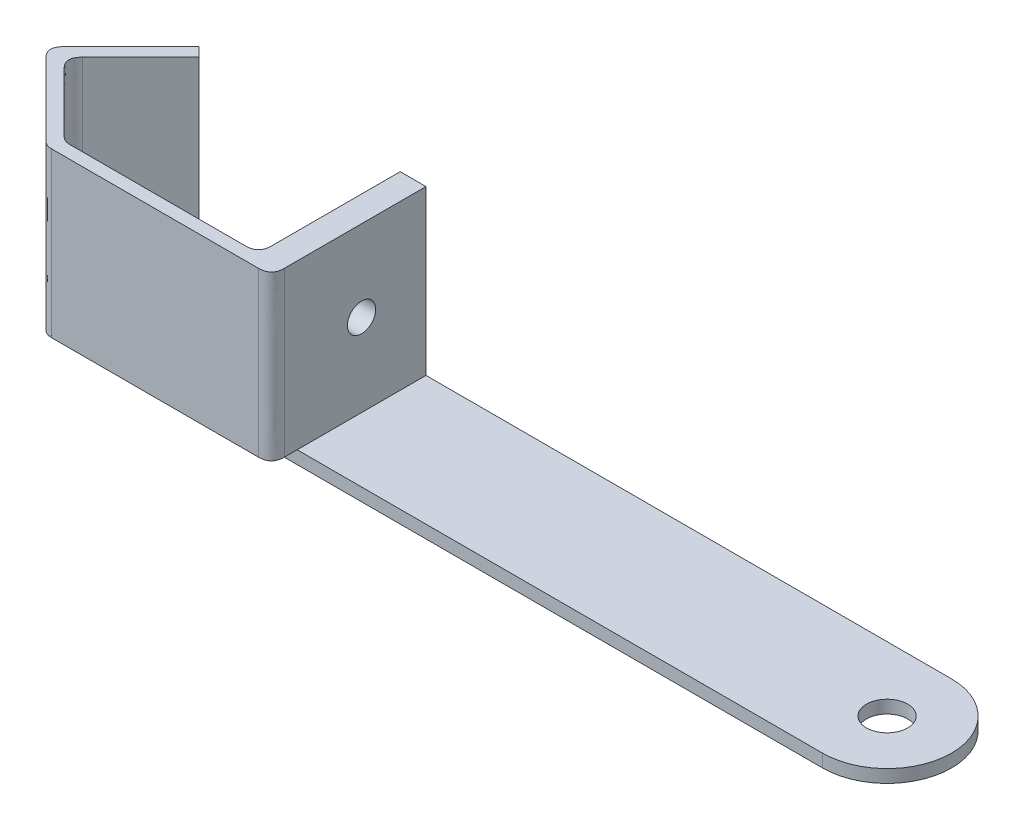
ISO-10303-21;
HEADER;
FILE_DESCRIPTION(('STEP AP214'),'2;1');
FILE_NAME('part.step','',(''),(''),'','','');
FILE_SCHEMA(('AUTOMOTIVE_DESIGN { 1 0 10303 214 1 1 1 1 }'));
ENDSEC;
DATA;
#1=APPLICATION_CONTEXT('core data for automotive mechanical design processes');
#2=APPLICATION_PROTOCOL_DEFINITION('international standard','automotive_design',2000,#1);
#3=PRODUCT_CONTEXT('',#1,'mechanical');
#4=PRODUCT('Part','Part','',(#3));
#5=PRODUCT_RELATED_PRODUCT_CATEGORY('part','',(#4));
#6=PRODUCT_DEFINITION_FORMATION('','',#4);
#7=PRODUCT_DEFINITION_CONTEXT('part definition',#1,'design');
#8=PRODUCT_DEFINITION('design','',#6,#7);
#9=PRODUCT_DEFINITION_SHAPE('','',#8);
#10=(LENGTH_UNIT() NAMED_UNIT(*) SI_UNIT(.MILLI.,.METRE.));
#11=(NAMED_UNIT(*) PLANE_ANGLE_UNIT() SI_UNIT($,.RADIAN.));
#12=(NAMED_UNIT(*) SI_UNIT($,.STERADIAN.) SOLID_ANGLE_UNIT());
#13=UNCERTAINTY_MEASURE_WITH_UNIT(LENGTH_MEASURE(1.E-05),#10,'distance_accuracy_value','');
#14=(GEOMETRIC_REPRESENTATION_CONTEXT(3) GLOBAL_UNCERTAINTY_ASSIGNED_CONTEXT((#13)) GLOBAL_UNIT_ASSIGNED_CONTEXT((#10,
#11,#12)) REPRESENTATION_CONTEXT('',''));
#15=CARTESIAN_POINT('',(0.,0.,0.));
#16=DIRECTION('',(0.,0.,1.));
#17=DIRECTION('',(1.,0.,0.));
#18=AXIS2_PLACEMENT_3D('',#15,#16,#17);
#19=CARTESIAN_POINT('',(-108.712,-2.54,0.));
#20=DIRECTION('',(-1.,0.,0.));
#21=DIRECTION('',(0.,0.,1.));
#22=AXIS2_PLACEMENT_3D('',#19,#20,#21);
#23=PLANE('',#22);
#24=CARTESIAN_POINT('',(-108.712,16.256,12.7));
#25=DIRECTION('',(1.,0.,0.));
#26=DIRECTION('',(0.,0.,-1.));
#27=AXIS2_PLACEMENT_3D('',#24,#25,#26);
#28=CIRCLE('',#27,2.794);
#29=CARTESIAN_POINT('',(-108.712,16.256,9.906));
#30=VERTEX_POINT('',#29);
#31=EDGE_CURVE('E281',#30,#30,#28,.T.);
#32=ORIENTED_EDGE('',*,*,#31,.T.);
#33=EDGE_LOOP('',(#32));
#34=FACE_BOUND('',#33,.T.);
#35=DIRECTION('',(0.,1.,0.));
#36=VECTOR('',#35,1.);
#37=CARTESIAN_POINT('',(-108.712,-2.54,25.4));
#38=LINE('',#37,#36);
#39=CARTESIAN_POINT('',(-108.712,-2.54,25.4));
#40=VERTEX_POINT('',#39);
#41=CARTESIAN_POINT('',(-108.712,0.,25.4));
#42=VERTEX_POINT('',#41);
#43=EDGE_CURVE('E511',#40,#42,#38,.T.);
#44=ORIENTED_EDGE('',*,*,#43,.T.);
#45=CARTESIAN_POINT('',(-108.712,33.8709,25.4));
#46=CARTESIAN_POINT('',(-108.712,22.0429666666667,25.4));
#47=CARTESIAN_POINT('',(-108.712,10.2150333333333,25.4));
#48=CARTESIAN_POINT('',(-108.712,-1.6129,25.4));
#49=(BOUNDED_CURVE() B_SPLINE_CURVE(3,(#45,#46,#47,#48),.UNSPECIFIED.,.F.,
.F.) B_SPLINE_CURVE_WITH_KNOTS((4,4),(0.000927099999999993,0.0364109),
.UNSPECIFIED.) CURVE() GEOMETRIC_REPRESENTATION_ITEM() RATIONAL_B_SPLINE_CURVE((1.,1.,1.,1.)) REPRESENTATION_ITEM(''));
#50=CARTESIAN_POINT('',(-108.712,32.258,25.4));
#51=VERTEX_POINT('',#50);
#52=EDGE_CURVE('E489',#42,#51,#49,.F.);
#53=ORIENTED_EDGE('',*,*,#52,.T.);
#54=DIRECTION('',(0.,0.,1.));
#55=VECTOR('',#54,1.);
#56=CARTESIAN_POINT('',(-108.712,32.258,0.));
#57=LINE('',#56,#55);
#58=CARTESIAN_POINT('',(-108.712,32.258,0.));
#59=VERTEX_POINT('',#58);
#60=EDGE_CURVE('E719',#59,#51,#57,.T.);
#61=ORIENTED_EDGE('',*,*,#60,.F.);
#62=DIRECTION('',(0.,1.,0.));
#63=VECTOR('',#62,1.);
#64=CARTESIAN_POINT('',(-108.712,-2.54,0.));
#65=LINE('',#64,#63);
#66=CARTESIAN_POINT('',(-108.712,-2.54,0.));
#67=VERTEX_POINT('',#66);
#68=EDGE_CURVE('E697',#67,#59,#65,.T.);
#69=ORIENTED_EDGE('',*,*,#68,.F.);
#70=DIRECTION('',(0.,0.,1.));
#71=VECTOR('',#70,1.);
#72=CARTESIAN_POINT('',(-108.712,-2.54,0.));
#73=LINE('',#72,#71);
#74=EDGE_CURVE('E1226',#67,#40,#73,.T.);
#75=ORIENTED_EDGE('',*,*,#74,.T.);
#76=EDGE_LOOP('',(#44,#53,#61,#69,#75));
#77=FACE_BOUND('',#76,.T.);
#78=ADVANCED_FACE('F54',(#34,#77),#23,.T.);
#79=CARTESIAN_POINT('',(0.,-2.54,12.7));
#80=DIRECTION('',(0.,1.,0.));
#81=DIRECTION('',(0.,0.,1.));
#82=AXIS2_PLACEMENT_3D('',#79,#80,#81);
#83=CYLINDRICAL_SURFACE('',#82,12.7);
#84=CARTESIAN_POINT('',(0.,0.,12.7));
#85=DIRECTION('',(0.,1.,0.));
#86=DIRECTION('',(0.,0.,1.));
#87=AXIS2_PLACEMENT_3D('',#84,#85,#86);
#88=CIRCLE('',#87,12.7);
#89=CARTESIAN_POINT('',(0.,0.,25.4));
#90=VERTEX_POINT('',#89);
#91=CARTESIAN_POINT('',(0.,0.,0.));
#92=VERTEX_POINT('',#91);
#93=EDGE_CURVE('E1213',#90,#92,#88,.T.);
#94=ORIENTED_EDGE('',*,*,#93,.F.);
#95=DIRECTION('',(0.,1.,0.));
#96=VECTOR('',#95,1.);
#97=CARTESIAN_POINT('',(0.,-2.54,25.4));
#98=LINE('',#97,#96);
#99=CARTESIAN_POINT('',(0.,-2.54,25.4));
#100=VERTEX_POINT('',#99);
#101=EDGE_CURVE('E503',#100,#90,#98,.T.);
#102=ORIENTED_EDGE('',*,*,#101,.F.);
#103=CARTESIAN_POINT('',(0.,-2.54,12.7));
#104=DIRECTION('',(0.,1.,0.));
#105=DIRECTION('',(0.,0.,1.));
#106=AXIS2_PLACEMENT_3D('',#103,#104,#105);
#107=CIRCLE('',#106,12.7);
#108=CARTESIAN_POINT('',(0.,-2.54,0.));
#109=VERTEX_POINT('',#108);
#110=EDGE_CURVE('E704',#100,#109,#107,.T.);
#111=ORIENTED_EDGE('',*,*,#110,.T.);
#112=DIRECTION('',(0.,1.,0.));
#113=VECTOR('',#112,1.);
#114=CARTESIAN_POINT('',(0.,-2.54,0.));
#115=LINE('',#114,#113);
#116=EDGE_CURVE('E716',#109,#92,#115,.T.);
#117=ORIENTED_EDGE('',*,*,#116,.T.);
#118=EDGE_LOOP('',(#94,#102,#111,#117));
#119=FACE_BOUND('',#118,.T.);
#120=ADVANCED_FACE('F670',(#119),#83,.T.);
#121=CARTESIAN_POINT('',(0.,-2.54,25.4));
#122=DIRECTION('',(0.,0.,1.));
#123=DIRECTION('',(1.,0.,0.));
#124=AXIS2_PLACEMENT_3D('',#121,#122,#123);
#125=PLANE('',#124);
#126=DIRECTION('',(1.,0.,0.));
#127=VECTOR('',#126,1.);
#128=CARTESIAN_POINT('',(0.,0.,25.4));
#129=LINE('',#128,#127);
#130=CARTESIAN_POINT('',(-103.632,0.,25.4));
#131=VERTEX_POINT('',#130);
#132=EDGE_CURVE('E700',#42,#131,#129,.T.);
#133=ORIENTED_EDGE('',*,*,#132,.F.);
#134=ORIENTED_EDGE('',*,*,#43,.F.);
#135=DIRECTION('',(1.,0.,0.));
#136=VECTOR('',#135,1.);
#137=CARTESIAN_POINT('',(0.,-2.54,25.4));
#138=LINE('',#137,#136);
#139=EDGE_CURVE('E718',#40,#100,#138,.T.);
#140=ORIENTED_EDGE('',*,*,#139,.T.);
#141=ORIENTED_EDGE('',*,*,#101,.T.);
#142=EDGE_CURVE('E705',#131,#90,#129,.T.);
#143=ORIENTED_EDGE('',*,*,#142,.F.);
#144=EDGE_LOOP('',(#133,#134,#140,#141,#143));
#145=FACE_BOUND('',#144,.T.);
#146=ADVANCED_FACE('F676',(#145),#125,.T.);
#147=CARTESIAN_POINT('',(0.,-2.54,0.));
#148=DIRECTION('',(0.,0.,-1.));
#149=DIRECTION('',(-1.,0.,0.));
#150=AXIS2_PLACEMENT_3D('',#147,#148,#149);
#151=PLANE('',#150);
#152=DIRECTION('',(-1.,0.,0.));
#153=VECTOR('',#152,1.);
#154=CARTESIAN_POINT('',(0.,0.,0.));
#155=LINE('',#154,#153);
#156=CARTESIAN_POINT('',(-103.632,0.,0.));
#157=VERTEX_POINT('',#156);
#158=EDGE_CURVE('E711',#92,#157,#155,.T.);
#159=ORIENTED_EDGE('',*,*,#158,.F.);
#160=ORIENTED_EDGE('',*,*,#116,.F.);
#161=DIRECTION('',(-1.,0.,0.));
#162=VECTOR('',#161,1.);
#163=CARTESIAN_POINT('',(0.,-2.54,0.));
#164=LINE('',#163,#162);
#165=EDGE_CURVE('E1229',#109,#67,#164,.T.);
#166=ORIENTED_EDGE('',*,*,#165,.T.);
#167=ORIENTED_EDGE('',*,*,#68,.T.);
#168=DIRECTION('',(-1.,0.,0.));
#169=VECTOR('',#168,1.);
#170=CARTESIAN_POINT('',(-103.632,32.258,0.));
#171=LINE('',#170,#169);
#172=CARTESIAN_POINT('',(-103.632,32.258,0.));
#173=VERTEX_POINT('',#172);
#174=EDGE_CURVE('E1238',#173,#59,#171,.T.);
#175=ORIENTED_EDGE('',*,*,#174,.F.);
#176=DIRECTION('',(0.,1.,0.));
#177=VECTOR('',#176,1.);
#178=CARTESIAN_POINT('',(-103.632,0.,0.));
#179=LINE('',#178,#177);
#180=EDGE_CURVE('E721',#157,#173,#179,.T.);
#181=ORIENTED_EDGE('',*,*,#180,.F.);
#182=EDGE_LOOP('',(#159,#160,#166,#167,#175,#181));
#183=FACE_BOUND('',#182,.T.);
#184=ADVANCED_FACE('F684',(#183),#151,.T.);
#185=CARTESIAN_POINT('',(0.,-2.54,12.7));
#186=DIRECTION('',(0.,1.,0.));
#187=DIRECTION('',(0.,0.,1.));
#188=AXIS2_PLACEMENT_3D('',#185,#186,#187);
#189=PLANE('',#188);
#190=CARTESIAN_POINT('',(0.,-2.54,12.7));
#191=DIRECTION('',(0.,1.,0.));
#192=DIRECTION('',(0.,0.,1.));
#193=AXIS2_PLACEMENT_3D('',#190,#191,#192);
#194=CIRCLE('',#193,4.064);
#195=CARTESIAN_POINT('',(0.,-2.54,16.764));
#196=VERTEX_POINT('',#195);
#197=EDGE_CURVE('E1217',#196,#196,#194,.T.);
#198=ORIENTED_EDGE('',*,*,#197,.T.);
#199=EDGE_LOOP('',(#198));
#200=FACE_BOUND('',#199,.T.);
#201=ORIENTED_EDGE('',*,*,#110,.F.);
#202=ORIENTED_EDGE('',*,*,#139,.F.);
#203=ORIENTED_EDGE('',*,*,#74,.F.);
#204=ORIENTED_EDGE('',*,*,#165,.F.);
#205=EDGE_LOOP('',(#201,#202,#203,#204));
#206=FACE_BOUND('',#205,.T.);
#207=ADVANCED_FACE('F966',(#200,#206),#189,.F.);
#208=CARTESIAN_POINT('',(0.,0.,12.7));
#209=DIRECTION('',(0.,1.,0.));
#210=DIRECTION('',(0.,0.,1.));
#211=AXIS2_PLACEMENT_3D('',#208,#209,#210);
#212=PLANE('',#211);
#213=DIRECTION('',(0.,0.,-1.));
#214=VECTOR('',#213,1.);
#215=CARTESIAN_POINT('',(-103.632,0.,0.));
#216=LINE('',#215,#214);
#217=EDGE_CURVE('E495',#131,#157,#216,.T.);
#218=ORIENTED_EDGE('',*,*,#217,.F.);
#219=ORIENTED_EDGE('',*,*,#142,.T.);
#220=ORIENTED_EDGE('',*,*,#93,.T.);
#221=ORIENTED_EDGE('',*,*,#158,.T.);
#222=EDGE_LOOP('',(#218,#219,#220,#221));
#223=FACE_BOUND('',#222,.T.);
#224=CARTESIAN_POINT('',(0.,0.,12.7));
#225=DIRECTION('',(0.,1.,0.));
#226=DIRECTION('',(0.,0.,1.));
#227=AXIS2_PLACEMENT_3D('',#224,#225,#226);
#228=CIRCLE('',#227,4.064);
#229=CARTESIAN_POINT('',(0.,0.,16.764));
#230=VERTEX_POINT('',#229);
#231=EDGE_CURVE('E1221',#230,#230,#228,.T.);
#232=ORIENTED_EDGE('',*,*,#231,.F.);
#233=EDGE_LOOP('',(#232));
#234=FACE_BOUND('',#233,.T.);
#235=ADVANCED_FACE('F959',(#223,#234),#212,.T.);
#236=CARTESIAN_POINT('',(0.,-2.54,12.7));
#237=DIRECTION('',(0.,1.,0.));
#238=DIRECTION('',(0.,0.,1.));
#239=AXIS2_PLACEMENT_3D('',#236,#237,#238);
#240=CYLINDRICAL_SURFACE('',#239,4.064);
#241=ORIENTED_EDGE('',*,*,#197,.F.);
#242=EDGE_LOOP('',(#241));
#243=FACE_BOUND('',#242,.T.);
#244=ORIENTED_EDGE('',*,*,#231,.T.);
#245=EDGE_LOOP('',(#244));
#246=FACE_BOUND('',#245,.T.);
#247=ADVANCED_FACE('F547',(#243,#246),#240,.F.);
#248=CARTESIAN_POINT('',(-103.632,0.,0.));
#249=DIRECTION('',(0.,1.,0.));
#250=DIRECTION('',(0.,0.,1.));
#251=AXIS2_PLACEMENT_3D('',#248,#249,#250);
#252=PLANE('',#251);
#253=DIRECTION('',(-0.707106781186533,0.,-0.707106781186563));
#254=VECTOR('',#253,1.);
#255=CARTESIAN_POINT('',(-141.097000000001,0.,37.4649999999994));
#256=LINE('',#255,#254);
#257=CARTESIAN_POINT('',(-148.825948775786,0.,29.7360512242138));
#258=VERTEX_POINT('',#257);
#259=CARTESIAN_POINT('',(-163.194358569497,0.,15.3676414305029));
#260=VERTEX_POINT('',#259);
#261=EDGE_CURVE('E729',#258,#260,#256,.T.);
#262=ORIENTED_EDGE('',*,*,#261,.T.);
#263=CARTESIAN_POINT('',(-163.194358569496,0.,11.7755389820752));
#264=CARTESIAN_POINT('',(-164.99040979371,0.,13.571590206289));
#265=CARTESIAN_POINT('',(-163.194358569497,0.,15.3676414305029));
#266=(BOUNDED_CURVE() B_SPLINE_CURVE(2,(#263,#264,#265),.UNSPECIFIED.,.F.,
.F.) B_SPLINE_CURVE_WITH_KNOTS((3,3),(0.,1.),
.UNSPECIFIED.) CURVE() GEOMETRIC_REPRESENTATION_ITEM() RATIONAL_B_SPLINE_CURVE((1.,1.,1.)) REPRESENTATION_ITEM(''));
#267=CARTESIAN_POINT('',(-163.194358569496,0.,11.7755389820752));
#268=VERTEX_POINT('',#267);
#269=EDGE_CURVE('E85',#260,#268,#266,.F.);
#270=ORIENTED_EDGE('',*,*,#269,.T.);
#271=DIRECTION('',(-0.707106781186571,0.,0.707106781186524));
#272=VECTOR('',#271,1.);
#273=CARTESIAN_POINT('',(-163.194358569496,0.,11.7755389820753));
#274=LINE('',#273,#272);
#275=CARTESIAN_POINT('',(-149.903579510314,0.,-1.5152400771068));
#276=VERTEX_POINT('',#275);
#277=EDGE_CURVE('E201',#276,#268,#274,.T.);
#278=ORIENTED_EDGE('',*,*,#277,.F.);
#279=DIRECTION('',(0.707106781186533,0.,0.707106781186562));
#280=VECTOR('',#279,1.);
#281=CARTESIAN_POINT('',(-149.903579510314,0.,-1.5152400771068));
#282=LINE('',#281,#280);
#283=CARTESIAN_POINT('',(-148.1075282861,0.,0.280811147107068));
#284=VERTEX_POINT('',#283);
#285=EDGE_CURVE('E208',#276,#284,#282,.T.);
#286=ORIENTED_EDGE('',*,*,#285,.T.);
#287=DIRECTION('',(-0.707106781186562,0.,0.707106781186533));
#288=VECTOR('',#287,1.);
#289=CARTESIAN_POINT('',(-161.398307345283,0.,13.5715902062891));
#290=LINE('',#289,#288);
#291=CARTESIAN_POINT('',(-159.602256121069,0.,11.7755389820754));
#292=VERTEX_POINT('',#291);
#293=EDGE_CURVE('E210',#284,#292,#290,.T.);
#294=ORIENTED_EDGE('',*,*,#293,.T.);
#295=CARTESIAN_POINT('',(-159.602256121069,0.,15.367641430503));
#296=CARTESIAN_POINT('',(-161.398307345283,0.,13.5715902062891));
#297=CARTESIAN_POINT('',(-159.602256121069,0.,11.7755389820754));
#298=(BOUNDED_CURVE() B_SPLINE_CURVE(2,(#295,#296,#297),.UNSPECIFIED.,.F.,
.F.) B_SPLINE_CURVE_WITH_KNOTS((3,3),(0.,1.),
.UNSPECIFIED.) CURVE() GEOMETRIC_REPRESENTATION_ITEM() RATIONAL_B_SPLINE_CURVE((1.,1.,1.)) REPRESENTATION_ITEM(''));
#299=CARTESIAN_POINT('',(-159.602256121069,0.,15.367641430503));
#300=VERTEX_POINT('',#299);
#301=EDGE_CURVE('E13',#292,#300,#298,.F.);
#302=ORIENTED_EDGE('',*,*,#301,.T.);
#303=DIRECTION('',(-0.707106781186533,0.,-0.707106781186562));
#304=VECTOR('',#303,1.);
#305=CARTESIAN_POINT('',(-148.825948775786,0.,26.1439487757862));
#306=LINE('',#305,#304);
#307=CARTESIAN_POINT('',(-147.773846327359,0.,27.1960512242138));
#308=VERTEX_POINT('',#307);
#309=EDGE_CURVE('E1183',#308,#300,#306,.T.);
#310=ORIENTED_EDGE('',*,*,#309,.F.);
#311=CARTESIAN_POINT('',(-145.977795103145,0.,27.94));
#312=CARTESIAN_POINT('',(-147.029897551572,0.,27.94));
#313=CARTESIAN_POINT('',(-147.773846327359,0.,27.1960512242138));
#314=(BOUNDED_CURVE() B_SPLINE_CURVE(2,(#311,#312,#313),.UNSPECIFIED.,.F.,
.F.) B_SPLINE_CURVE_WITH_KNOTS((3,3),(0.,1.),
.UNSPECIFIED.) CURVE() GEOMETRIC_REPRESENTATION_ITEM() RATIONAL_B_SPLINE_CURVE((1.,1.,1.)) REPRESENTATION_ITEM(''));
#315=CARTESIAN_POINT('',(-145.977795103145,0.,27.94));
#316=VERTEX_POINT('',#315);
#317=EDGE_CURVE('E399',#308,#316,#314,.F.);
#318=ORIENTED_EDGE('',*,*,#317,.T.);
#319=DIRECTION('',(1.,0.,0.));
#320=VECTOR('',#319,1.);
#321=CARTESIAN_POINT('',(-108.712,0.,27.94));
#322=LINE('',#321,#320);
#323=CARTESIAN_POINT('',(-111.252,0.,27.94));
#324=VERTEX_POINT('',#323);
#325=EDGE_CURVE('E726',#316,#324,#322,.T.);
#326=ORIENTED_EDGE('',*,*,#325,.T.);
#327=CARTESIAN_POINT('',(-108.712,0.,25.4));
#328=CARTESIAN_POINT('',(-108.712,0.,27.94));
#329=CARTESIAN_POINT('',(-111.252,0.,27.94));
#330=(BOUNDED_CURVE() B_SPLINE_CURVE(2,(#327,#328,#329),.UNSPECIFIED.,.F.,
.F.) B_SPLINE_CURVE_WITH_KNOTS((3,3),(0.,1.),
.UNSPECIFIED.) CURVE() GEOMETRIC_REPRESENTATION_ITEM() RATIONAL_B_SPLINE_CURVE((1.,1.,1.)) REPRESENTATION_ITEM(''));
#331=EDGE_CURVE('E446',#324,#42,#330,.F.);
#332=ORIENTED_EDGE('',*,*,#331,.T.);
#333=ORIENTED_EDGE('',*,*,#132,.T.);
#334=CARTESIAN_POINT('',(-103.632,0.,27.94));
#335=VERTEX_POINT('',#334);
#336=EDGE_CURVE('E521',#335,#131,#216,.T.);
#337=ORIENTED_EDGE('',*,*,#336,.F.);
#338=CARTESIAN_POINT('',(-106.172,0.,30.48));
#339=CARTESIAN_POINT('',(-103.632,0.,30.48));
#340=CARTESIAN_POINT('',(-103.632,0.,27.94));
#341=(BOUNDED_CURVE() B_SPLINE_CURVE(2,(#338,#339,#340),.UNSPECIFIED.,.F.,
.F.) B_SPLINE_CURVE_WITH_KNOTS((3,3),(0.,1.),
.UNSPECIFIED.) CURVE() GEOMETRIC_REPRESENTATION_ITEM() RATIONAL_B_SPLINE_CURVE((1.,1.,1.)) REPRESENTATION_ITEM(''));
#342=CARTESIAN_POINT('',(-106.172,0.,30.48));
#343=VERTEX_POINT('',#342);
#344=EDGE_CURVE('E471',#335,#343,#341,.F.);
#345=ORIENTED_EDGE('',*,*,#344,.T.);
#346=DIRECTION('',(-1.,0.,0.));
#347=VECTOR('',#346,1.);
#348=CARTESIAN_POINT('',(-103.632,0.,30.48));
#349=LINE('',#348,#347);
#350=CARTESIAN_POINT('',(-147.029897551572,0.,30.48));
#351=VERTEX_POINT('',#350);
#352=EDGE_CURVE('E524',#343,#351,#349,.T.);
#353=ORIENTED_EDGE('',*,*,#352,.T.);
#354=CARTESIAN_POINT('',(-148.825948775786,0.,29.7360512242138));
#355=CARTESIAN_POINT('',(-148.082,0.,30.48));
#356=CARTESIAN_POINT('',(-147.029897551572,0.,30.48));
#357=(BOUNDED_CURVE() B_SPLINE_CURVE(2,(#354,#355,#356),.UNSPECIFIED.,.F.,
.F.) B_SPLINE_CURVE_WITH_KNOTS((3,3),(0.,1.),
.UNSPECIFIED.) CURVE() GEOMETRIC_REPRESENTATION_ITEM() RATIONAL_B_SPLINE_CURVE((1.,1.,1.)) REPRESENTATION_ITEM(''));
#358=EDGE_CURVE('E410',#351,#258,#357,.F.);
#359=ORIENTED_EDGE('',*,*,#358,.T.);
#360=EDGE_LOOP('',(#262,#270,#278,#286,#294,#302,#310,#318,#326,#332,#333,#337,#345,#353,#359));
#361=FACE_BOUND('',#360,.T.);
#362=ADVANCED_FACE('F294',(#361),#252,.F.);
#363=CARTESIAN_POINT('',(-103.632,32.258,0.));
#364=DIRECTION('',(0.,-1.,0.));
#365=DIRECTION('',(0.,0.,-1.));
#366=AXIS2_PLACEMENT_3D('',#363,#364,#365);
#367=PLANE('',#366);
#368=DIRECTION('',(-0.707106781186571,0.,0.707106781186524));
#369=VECTOR('',#368,1.);
#370=CARTESIAN_POINT('',(-163.194358569496,32.258,11.7755389820753));
#371=LINE('',#370,#369);
#372=CARTESIAN_POINT('',(-149.903579510314,32.258,-1.5152400771068));
#373=VERTEX_POINT('',#372);
#374=CARTESIAN_POINT('',(-163.194358569496,32.258,11.7755389820752));
#375=VERTEX_POINT('',#374);
#376=EDGE_CURVE('E191',#373,#375,#371,.T.);
#377=ORIENTED_EDGE('',*,*,#376,.T.);
#378=CARTESIAN_POINT('',(-163.194358569497,32.258,15.3676414305029));
#379=CARTESIAN_POINT('',(-164.99040979371,32.258,13.571590206289));
#380=CARTESIAN_POINT('',(-163.194358569496,32.258,11.7755389820752));
#381=(BOUNDED_CURVE() B_SPLINE_CURVE(2,(#378,#379,#380),.UNSPECIFIED.,.F.,
.F.) B_SPLINE_CURVE_WITH_KNOTS((3,3),(0.,1.),
.UNSPECIFIED.) CURVE() GEOMETRIC_REPRESENTATION_ITEM() RATIONAL_B_SPLINE_CURVE((1.,1.,1.)) REPRESENTATION_ITEM(''));
#382=CARTESIAN_POINT('',(-163.194358569497,32.258,15.3676414305029));
#383=VERTEX_POINT('',#382);
#384=EDGE_CURVE('E377',#375,#383,#381,.F.);
#385=ORIENTED_EDGE('',*,*,#384,.T.);
#386=DIRECTION('',(-0.707106781186533,0.,-0.707106781186563));
#387=VECTOR('',#386,1.);
#388=CARTESIAN_POINT('',(-150.622,32.258,27.94));
#389=LINE('',#388,#387);
#390=CARTESIAN_POINT('',(-148.825948775786,32.258,29.7360512242138));
#391=VERTEX_POINT('',#390);
#392=EDGE_CURVE('E733',#391,#383,#389,.T.);
#393=ORIENTED_EDGE('',*,*,#392,.F.);
#394=CARTESIAN_POINT('',(-147.029897551572,32.258,30.48));
#395=CARTESIAN_POINT('',(-148.082,32.258,30.48));
#396=CARTESIAN_POINT('',(-148.825948775786,32.258,29.7360512242138));
#397=(BOUNDED_CURVE() B_SPLINE_CURVE(2,(#394,#395,#396),.UNSPECIFIED.,.F.,
.F.) B_SPLINE_CURVE_WITH_KNOTS((3,3),(0.,1.),
.UNSPECIFIED.) CURVE() GEOMETRIC_REPRESENTATION_ITEM() RATIONAL_B_SPLINE_CURVE((1.,1.,1.)) REPRESENTATION_ITEM(''));
#398=CARTESIAN_POINT('',(-147.029897551572,32.258,30.48));
#399=VERTEX_POINT('',#398);
#400=EDGE_CURVE('E421',#391,#399,#397,.F.);
#401=ORIENTED_EDGE('',*,*,#400,.T.);
#402=DIRECTION('',(-1.,0.,0.));
#403=VECTOR('',#402,1.);
#404=CARTESIAN_POINT('',(-103.632,32.258,30.48));
#405=LINE('',#404,#403);
#406=CARTESIAN_POINT('',(-106.172,32.258,30.48));
#407=VERTEX_POINT('',#406);
#408=EDGE_CURVE('E1242',#407,#399,#405,.T.);
#409=ORIENTED_EDGE('',*,*,#408,.F.);
#410=CARTESIAN_POINT('',(-103.632,32.258,27.94));
#411=CARTESIAN_POINT('',(-103.632,32.258,30.48));
#412=CARTESIAN_POINT('',(-106.172,32.258,30.48));
#413=(BOUNDED_CURVE() B_SPLINE_CURVE(2,(#410,#411,#412),.UNSPECIFIED.,.F.,
.F.) B_SPLINE_CURVE_WITH_KNOTS((3,3),(0.,1.),
.UNSPECIFIED.) CURVE() GEOMETRIC_REPRESENTATION_ITEM() RATIONAL_B_SPLINE_CURVE((1.,1.,1.)) REPRESENTATION_ITEM(''));
#414=CARTESIAN_POINT('',(-103.632,32.258,27.94));
#415=VERTEX_POINT('',#414);
#416=EDGE_CURVE('E460',#407,#415,#413,.F.);
#417=ORIENTED_EDGE('',*,*,#416,.T.);
#418=DIRECTION('',(0.,0.,1.));
#419=VECTOR('',#418,1.);
#420=CARTESIAN_POINT('',(-103.632,32.258,0.));
#421=LINE('',#420,#419);
#422=EDGE_CURVE('E525',#173,#415,#421,.T.);
#423=ORIENTED_EDGE('',*,*,#422,.F.);
#424=ORIENTED_EDGE('',*,*,#174,.T.);
#425=ORIENTED_EDGE('',*,*,#60,.T.);
#426=CARTESIAN_POINT('',(-111.252,32.258,27.94));
#427=CARTESIAN_POINT('',(-108.712,32.258,27.94));
#428=CARTESIAN_POINT('',(-108.712,32.258,25.4));
#429=(BOUNDED_CURVE() B_SPLINE_CURVE(2,(#426,#427,#428),.UNSPECIFIED.,.F.,
.F.) B_SPLINE_CURVE_WITH_KNOTS((3,3),(0.,1.),
.UNSPECIFIED.) CURVE() GEOMETRIC_REPRESENTATION_ITEM() RATIONAL_B_SPLINE_CURVE((1.,1.,1.)) REPRESENTATION_ITEM(''));
#430=CARTESIAN_POINT('',(-111.252,32.258,27.94));
#431=VERTEX_POINT('',#430);
#432=EDGE_CURVE('E453',#51,#431,#429,.F.);
#433=ORIENTED_EDGE('',*,*,#432,.T.);
#434=DIRECTION('',(-1.,0.,0.));
#435=VECTOR('',#434,1.);
#436=CARTESIAN_POINT('',(-108.712,32.258,27.94));
#437=LINE('',#436,#435);
#438=CARTESIAN_POINT('',(-145.977795103145,32.258,27.94));
#439=VERTEX_POINT('',#438);
#440=EDGE_CURVE('E706',#431,#439,#437,.T.);
#441=ORIENTED_EDGE('',*,*,#440,.T.);
#442=CARTESIAN_POINT('',(-147.773846327359,32.258,27.1960512242138));
#443=CARTESIAN_POINT('',(-147.029897551572,32.258,27.94));
#444=CARTESIAN_POINT('',(-145.977795103145,32.258,27.94));
#445=(BOUNDED_CURVE() B_SPLINE_CURVE(2,(#442,#443,#444),.UNSPECIFIED.,.F.,
.F.) B_SPLINE_CURVE_WITH_KNOTS((3,3),(0.,1.),
.UNSPECIFIED.) CURVE() GEOMETRIC_REPRESENTATION_ITEM() RATIONAL_B_SPLINE_CURVE((1.,1.,1.)) REPRESENTATION_ITEM(''));
#446=CARTESIAN_POINT('',(-147.773846327359,32.258,27.1960512242138));
#447=VERTEX_POINT('',#446);
#448=EDGE_CURVE('E404',#439,#447,#445,.F.);
#449=ORIENTED_EDGE('',*,*,#448,.T.);
#450=DIRECTION('',(-0.707106781186533,0.,-0.707106781186562));
#451=VECTOR('',#450,1.);
#452=CARTESIAN_POINT('',(-148.825948775786,32.258,26.1439487757862));
#453=LINE('',#452,#451);
#454=CARTESIAN_POINT('',(-159.602256121069,32.258,15.367641430503));
#455=VERTEX_POINT('',#454);
#456=EDGE_CURVE('E200',#447,#455,#453,.T.);
#457=ORIENTED_EDGE('',*,*,#456,.T.);
#458=CARTESIAN_POINT('',(-159.602256121069,32.258,11.7755389820754));
#459=CARTESIAN_POINT('',(-161.398307345283,32.258,13.5715902062891));
#460=CARTESIAN_POINT('',(-159.602256121069,32.258,15.367641430503));
#461=(BOUNDED_CURVE() B_SPLINE_CURVE(2,(#458,#459,#460),.UNSPECIFIED.,.F.,
.F.) B_SPLINE_CURVE_WITH_KNOTS((3,3),(0.,1.),
.UNSPECIFIED.) CURVE() GEOMETRIC_REPRESENTATION_ITEM() RATIONAL_B_SPLINE_CURVE((1.,1.,1.)) REPRESENTATION_ITEM(''));
#462=CARTESIAN_POINT('',(-159.602256121069,32.258,11.7755389820754));
#463=VERTEX_POINT('',#462);
#464=EDGE_CURVE('E69',#455,#463,#461,.F.);
#465=ORIENTED_EDGE('',*,*,#464,.T.);
#466=DIRECTION('',(0.707106781186562,0.,-0.707106781186533));
#467=VECTOR('',#466,1.);
#468=CARTESIAN_POINT('',(-148.1075282861,32.258,0.280811147107068));
#469=LINE('',#468,#467);
#470=CARTESIAN_POINT('',(-148.1075282861,32.258,0.280811147107068));
#471=VERTEX_POINT('',#470);
#472=EDGE_CURVE('E214',#463,#471,#469,.T.);
#473=ORIENTED_EDGE('',*,*,#472,.T.);
#474=DIRECTION('',(0.707106781186533,0.,0.707106781186562));
#475=VECTOR('',#474,1.);
#476=CARTESIAN_POINT('',(-149.903579510314,32.258,-1.5152400771068));
#477=LINE('',#476,#475);
#478=EDGE_CURVE('E206',#373,#471,#477,.T.);
#479=ORIENTED_EDGE('',*,*,#478,.F.);
#480=EDGE_LOOP('',(#377,#385,#393,#401,#409,#417,#423,#424,#425,#433,#441,#449,#457,#465,#473,#479));
#481=FACE_BOUND('',#480,.T.);
#482=ADVANCED_FACE('F212',(#481),#367,.F.);
#483=CARTESIAN_POINT('',(-103.632,0.,30.48));
#484=DIRECTION('',(0.,0.,-1.));
#485=DIRECTION('',(-1.,0.,0.));
#486=AXIS2_PLACEMENT_3D('',#483,#484,#485);
#487=PLANE('',#486);
#488=ORIENTED_EDGE('',*,*,#408,.T.);
#489=CARTESIAN_POINT('',(-147.029897551572,-1.6129,30.48));
#490=CARTESIAN_POINT('',(-147.029897551572,10.2150333333333,30.48));
#491=CARTESIAN_POINT('',(-147.029897551572,22.0429666666667,30.48));
#492=CARTESIAN_POINT('',(-147.029897551572,33.8709,30.48));
#493=(BOUNDED_CURVE() B_SPLINE_CURVE(3,(#489,#490,#491,#492),.UNSPECIFIED.,.F.,
.F.) B_SPLINE_CURVE_WITH_KNOTS((4,4),(0.00092712500000001,0.036410925),
.UNSPECIFIED.) CURVE() GEOMETRIC_REPRESENTATION_ITEM() RATIONAL_B_SPLINE_CURVE((1.,1.,1.,1.)) REPRESENTATION_ITEM(''));
#494=EDGE_CURVE('E415',#399,#351,#493,.F.);
#495=ORIENTED_EDGE('',*,*,#494,.T.);
#496=ORIENTED_EDGE('',*,*,#352,.F.);
#497=CARTESIAN_POINT('',(-106.172,33.8709,30.48));
#498=CARTESIAN_POINT('',(-106.172,22.0429666666667,30.48));
#499=CARTESIAN_POINT('',(-106.172,10.2150333333333,30.48));
#500=CARTESIAN_POINT('',(-106.172,-1.6129,30.48));
#501=(BOUNDED_CURVE() B_SPLINE_CURVE(3,(#497,#498,#499,#500),.UNSPECIFIED.,.F.,
.F.) B_SPLINE_CURVE_WITH_KNOTS((4,4),(-0.0016129,0.0338709),
.UNSPECIFIED.) CURVE() GEOMETRIC_REPRESENTATION_ITEM() RATIONAL_B_SPLINE_CURVE((1.,1.,1.,1.)) REPRESENTATION_ITEM(''));
#502=EDGE_CURVE('E465',#343,#407,#501,.F.);
#503=ORIENTED_EDGE('',*,*,#502,.T.);
#504=EDGE_LOOP('',(#488,#495,#496,#503));
#505=FACE_BOUND('',#504,.T.);
#506=ADVANCED_FACE('F541',(#505),#487,.F.);
#507=CARTESIAN_POINT('',(-103.632,0.,0.));
#508=DIRECTION('',(1.,0.,0.));
#509=DIRECTION('',(0.,0.,-1.));
#510=AXIS2_PLACEMENT_3D('',#507,#508,#509);
#511=PLANE('',#510);
#512=CARTESIAN_POINT('',(-103.632,16.256,12.7));
#513=DIRECTION('',(1.,0.,0.));
#514=DIRECTION('',(0.,0.,-1.));
#515=AXIS2_PLACEMENT_3D('',#512,#513,#514);
#516=CIRCLE('',#515,2.794);
#517=CARTESIAN_POINT('',(-103.632,16.256,9.906));
#518=VERTEX_POINT('',#517);
#519=EDGE_CURVE('E841',#518,#518,#516,.T.);
#520=ORIENTED_EDGE('',*,*,#519,.F.);
#521=EDGE_LOOP('',(#520));
#522=FACE_BOUND('',#521,.T.);
#523=ORIENTED_EDGE('',*,*,#422,.T.);
#524=CARTESIAN_POINT('',(-103.632,-1.6129,27.94));
#525=CARTESIAN_POINT('',(-103.632,10.2150333333333,27.94));
#526=CARTESIAN_POINT('',(-103.632,22.0429666666667,27.94));
#527=CARTESIAN_POINT('',(-103.632,33.8709,27.94));
#528=(BOUNDED_CURVE() B_SPLINE_CURVE(3,(#524,#525,#526,#527),.UNSPECIFIED.,.F.,
.F.) B_SPLINE_CURVE_WITH_KNOTS((4,4),(-0.0016129,0.0338709),
.UNSPECIFIED.) CURVE() GEOMETRIC_REPRESENTATION_ITEM() RATIONAL_B_SPLINE_CURVE((1.,1.,1.,1.)) REPRESENTATION_ITEM(''));
#529=EDGE_CURVE('E476',#415,#335,#528,.F.);
#530=ORIENTED_EDGE('',*,*,#529,.T.);
#531=ORIENTED_EDGE('',*,*,#336,.T.);
#532=ORIENTED_EDGE('',*,*,#217,.T.);
#533=ORIENTED_EDGE('',*,*,#180,.T.);
#534=EDGE_LOOP('',(#523,#530,#531,#532,#533));
#535=FACE_BOUND('',#534,.T.);
#536=ADVANCED_FACE('F532',(#522,#535),#511,.T.);
#537=CARTESIAN_POINT('',(0.,0.,27.94));
#538=DIRECTION('',(0.,0.,1.));
#539=DIRECTION('',(1.,0.,0.));
#540=AXIS2_PLACEMENT_3D('',#537,#538,#539);
#541=PLANE('',#540);
#542=ORIENTED_EDGE('',*,*,#325,.F.);
#543=CARTESIAN_POINT('',(-145.977795103145,33.8709,27.94));
#544=CARTESIAN_POINT('',(-145.977795103145,22.0429666666667,27.94));
#545=CARTESIAN_POINT('',(-145.977795103145,10.2150333333333,27.94));
#546=CARTESIAN_POINT('',(-145.977795103145,-1.61290000000001,27.94));
#547=(BOUNDED_CURVE() B_SPLINE_CURVE(3,(#543,#544,#545,#546),.UNSPECIFIED.,.F.,
.F.) B_SPLINE_CURVE_WITH_KNOTS((4,4),(-0.00161289999999994,0.0338709000000001),
.UNSPECIFIED.) CURVE() GEOMETRIC_REPRESENTATION_ITEM() RATIONAL_B_SPLINE_CURVE((1.,1.,1.,1.)) REPRESENTATION_ITEM(''));
#548=EDGE_CURVE('E441',#316,#439,#547,.F.);
#549=ORIENTED_EDGE('',*,*,#548,.T.);
#550=ORIENTED_EDGE('',*,*,#440,.F.);
#551=CARTESIAN_POINT('',(-111.252,-1.6129,27.94));
#552=CARTESIAN_POINT('',(-111.252,10.2150333333333,27.94));
#553=CARTESIAN_POINT('',(-111.252,22.0429666666667,27.94));
#554=CARTESIAN_POINT('',(-111.252,33.8709,27.94));
#555=(BOUNDED_CURVE() B_SPLINE_CURVE(3,(#551,#552,#553,#554),.UNSPECIFIED.,.F.,
.F.) B_SPLINE_CURVE_WITH_KNOTS((4,4),(0.000927099999999996,0.0364109),
.UNSPECIFIED.) CURVE() GEOMETRIC_REPRESENTATION_ITEM() RATIONAL_B_SPLINE_CURVE((1.,1.,1.,1.)) REPRESENTATION_ITEM(''));
#556=EDGE_CURVE('E482',#431,#324,#555,.F.);
#557=ORIENTED_EDGE('',*,*,#556,.T.);
#558=EDGE_LOOP('',(#542,#549,#550,#557));
#559=FACE_BOUND('',#558,.T.);
#560=ADVANCED_FACE('F540',(#559),#541,.F.);
#561=CARTESIAN_POINT('',(-108.712,-1.6129,25.4));
#562=CARTESIAN_POINT('',(-108.712,10.2150333333333,25.4));
#563=CARTESIAN_POINT('',(-108.712,22.0429666666667,25.4));
#564=CARTESIAN_POINT('',(-108.712,33.8709,25.4));
#565=CARTESIAN_POINT('',(-108.712,-1.6129,27.94));
#566=CARTESIAN_POINT('',(-108.712,10.2150333333333,27.94));
#567=CARTESIAN_POINT('',(-108.712,22.0429666666667,27.94));
#568=CARTESIAN_POINT('',(-108.712,33.8709,27.94));
#569=CARTESIAN_POINT('',(-111.252,-1.6129,27.94));
#570=CARTESIAN_POINT('',(-111.252,10.2150333333333,27.94));
#571=CARTESIAN_POINT('',(-111.252,22.0429666666667,27.94));
#572=CARTESIAN_POINT('',(-111.252,33.8709,27.94));
#573=(BOUNDED_SURFACE() B_SPLINE_SURFACE(2,3,((#561,#562,#563,#564),(#565,#566,#567,#568),(#569,
#570,#571,#572)),.UNSPECIFIED.,.F.,.F.,.F.) B_SPLINE_SURFACE_WITH_KNOTS((3,3),(4,4),(0.,1.),
(0.000927099999999996,0.0364109),
.UNSPECIFIED.) GEOMETRIC_REPRESENTATION_ITEM() RATIONAL_B_SPLINE_SURFACE(((1.,1.,1.,1.),(1.,1.,
1.,1.),(1.,1.,1.,1.))) REPRESENTATION_ITEM('') SURFACE());
#574=ORIENTED_EDGE('',*,*,#331,.F.);
#575=ORIENTED_EDGE('',*,*,#556,.F.);
#576=ORIENTED_EDGE('',*,*,#432,.F.);
#577=ORIENTED_EDGE('',*,*,#52,.F.);
#578=EDGE_LOOP('',(#574,#575,#576,#577));
#579=FACE_BOUND('',#578,.T.);
#580=ADVANCED_FACE('F884',(#579),#573,.T.);
#581=CARTESIAN_POINT('',(-106.172,-1.6129,30.48));
#582=CARTESIAN_POINT('',(-106.172,10.2150333333333,30.48));
#583=CARTESIAN_POINT('',(-106.172,22.0429666666667,30.48));
#584=CARTESIAN_POINT('',(-106.172,33.8709,30.48));
#585=CARTESIAN_POINT('',(-103.632,-1.6129,30.48));
#586=CARTESIAN_POINT('',(-103.632,10.2150333333333,30.48));
#587=CARTESIAN_POINT('',(-103.632,22.0429666666667,30.48));
#588=CARTESIAN_POINT('',(-103.632,33.8709,30.48));
#589=CARTESIAN_POINT('',(-103.632,-1.6129,27.94));
#590=CARTESIAN_POINT('',(-103.632,10.2150333333333,27.94));
#591=CARTESIAN_POINT('',(-103.632,22.0429666666667,27.94));
#592=CARTESIAN_POINT('',(-103.632,33.8709,27.94));
#593=(BOUNDED_SURFACE() B_SPLINE_SURFACE(2,3,((#581,#582,#583,#584),(#585,#586,#587,#588),(#589,
#590,#591,#592)),.UNSPECIFIED.,.F.,.F.,.F.) B_SPLINE_SURFACE_WITH_KNOTS((3,3),(4,4),(0.,1.),
(-0.0016129,0.0338709),
.UNSPECIFIED.) GEOMETRIC_REPRESENTATION_ITEM() RATIONAL_B_SPLINE_SURFACE(((1.,1.,1.,1.),(1.,1.,
1.,1.),(1.,1.,1.,1.))) REPRESENTATION_ITEM('') SURFACE());
#594=ORIENTED_EDGE('',*,*,#416,.F.);
#595=ORIENTED_EDGE('',*,*,#502,.F.);
#596=ORIENTED_EDGE('',*,*,#344,.F.);
#597=ORIENTED_EDGE('',*,*,#529,.F.);
#598=EDGE_LOOP('',(#594,#595,#596,#597));
#599=FACE_BOUND('',#598,.T.);
#600=ADVANCED_FACE('F597',(#599),#593,.T.);
#601=CARTESIAN_POINT('',(-150.622,-2.54002500000002,27.94));
#602=DIRECTION('',(0.707106781186563,0.,-0.707106781186533));
#603=DIRECTION('',(-0.707106781186533,0.,-0.707106781186563));
#604=AXIS2_PLACEMENT_3D('',#601,#602,#603);
#605=PLANE('',#604);
#606=ORIENTED_EDGE('',*,*,#392,.T.);
#607=CARTESIAN_POINT('',(-163.194358569497,-1.61290000000001,15.3676414305029));
#608=CARTESIAN_POINT('',(-163.194358569497,10.2150333333333,15.3676414305029));
#609=CARTESIAN_POINT('',(-163.194358569497,22.0429666666667,15.3676414305029));
#610=CARTESIAN_POINT('',(-163.194358569497,33.8709,15.3676414305029));
#611=(BOUNDED_CURVE() B_SPLINE_CURVE(3,(#607,#608,#609,#610),.UNSPECIFIED.,.F.,
.F.) B_SPLINE_CURVE_WITH_KNOTS((4,4),(-0.036410925,-0.000927125000000015),
.UNSPECIFIED.) CURVE() GEOMETRIC_REPRESENTATION_ITEM() RATIONAL_B_SPLINE_CURVE((1.,1.,1.,1.)) REPRESENTATION_ITEM(''));
#612=EDGE_CURVE('E367',#383,#260,#611,.F.);
#613=ORIENTED_EDGE('',*,*,#612,.T.);
#614=ORIENTED_EDGE('',*,*,#261,.F.);
#615=CARTESIAN_POINT('',(-148.825948775786,33.8709,29.7360512242138));
#616=CARTESIAN_POINT('',(-148.825948775786,22.0429666666667,29.7360512242138));
#617=CARTESIAN_POINT('',(-148.825948775786,10.2150333333333,29.7360512242138));
#618=CARTESIAN_POINT('',(-148.825948775786,-1.6129,29.7360512242138));
#619=(BOUNDED_CURVE() B_SPLINE_CURVE(3,(#615,#616,#617,#618),.UNSPECIFIED.,.F.,
.F.) B_SPLINE_CURVE_WITH_KNOTS((4,4),(0.000927125000000008,0.036410925),
.UNSPECIFIED.) CURVE() GEOMETRIC_REPRESENTATION_ITEM() RATIONAL_B_SPLINE_CURVE((1.,1.,1.,1.)) REPRESENTATION_ITEM(''));
#620=EDGE_CURVE('E429',#258,#391,#619,.F.);
#621=ORIENTED_EDGE('',*,*,#620,.T.);
#622=EDGE_LOOP('',(#606,#613,#614,#621));
#623=FACE_BOUND('',#622,.T.);
#624=ADVANCED_FACE('F255',(#623),#605,.F.);
#625=CARTESIAN_POINT('',(-148.825948775786,0.,26.1439487757862));
#626=DIRECTION('',(0.707106781186562,0.,-0.707106781186533));
#627=DIRECTION('',(-0.707106781186533,0.,-0.707106781186562));
#628=AXIS2_PLACEMENT_3D('',#625,#626,#627);
#629=PLANE('',#628);
#630=ORIENTED_EDGE('',*,*,#309,.T.);
#631=CARTESIAN_POINT('',(-159.602256121069,33.8709,15.367641430503));
#632=CARTESIAN_POINT('',(-159.602256121069,22.0429666666667,15.367641430503));
#633=CARTESIAN_POINT('',(-159.602256121069,10.2150333333332,15.367641430503));
#634=CARTESIAN_POINT('',(-159.602256121069,-1.6129000000001,15.367641430503));
#635=(BOUNDED_CURVE() B_SPLINE_CURVE(3,(#631,#632,#633,#634),.UNSPECIFIED.,.F.,
.F.) B_SPLINE_CURVE_WITH_KNOTS((4,4),(-0.0338709,0.00161290000000008),
.UNSPECIFIED.) CURVE() GEOMETRIC_REPRESENTATION_ITEM() RATIONAL_B_SPLINE_CURVE((1.,1.,1.,1.)) REPRESENTATION_ITEM(''));
#636=EDGE_CURVE('E306',#300,#455,#635,.F.);
#637=ORIENTED_EDGE('',*,*,#636,.T.);
#638=ORIENTED_EDGE('',*,*,#456,.F.);
#639=CARTESIAN_POINT('',(-147.773846327359,-1.61290000000001,27.1960512242138));
#640=CARTESIAN_POINT('',(-147.773846327359,10.2150333333333,27.1960512242138));
#641=CARTESIAN_POINT('',(-147.773846327359,22.0429666666667,27.1960512242138));
#642=CARTESIAN_POINT('',(-147.773846327359,33.8709,27.1960512242138));
#643=(BOUNDED_CURVE() B_SPLINE_CURVE(3,(#639,#640,#641,#642),.UNSPECIFIED.,.F.,
.F.) B_SPLINE_CURVE_WITH_KNOTS((4,4),(-0.00161289999999995,0.0338709000000001),
.UNSPECIFIED.) CURVE() GEOMETRIC_REPRESENTATION_ITEM() RATIONAL_B_SPLINE_CURVE((1.,1.,1.,1.)) REPRESENTATION_ITEM(''));
#644=EDGE_CURVE('E436',#447,#308,#643,.F.);
#645=ORIENTED_EDGE('',*,*,#644,.T.);
#646=EDGE_LOOP('',(#630,#637,#638,#645));
#647=FACE_BOUND('',#646,.T.);
#648=ADVANCED_FACE('F250',(#647),#629,.T.);
#649=CARTESIAN_POINT('',(-145.977795103145,-1.61290000000001,27.94));
#650=CARTESIAN_POINT('',(-145.977795103145,10.2150333333333,27.94));
#651=CARTESIAN_POINT('',(-145.977795103145,22.0429666666667,27.94));
#652=CARTESIAN_POINT('',(-145.977795103145,33.8709,27.94));
#653=CARTESIAN_POINT('',(-147.029897551572,-1.61290000000001,27.94));
#654=CARTESIAN_POINT('',(-147.029897551572,10.2150333333333,27.94));
#655=CARTESIAN_POINT('',(-147.029897551572,22.0429666666667,27.94));
#656=CARTESIAN_POINT('',(-147.029897551572,33.8709,27.94));
#657=CARTESIAN_POINT('',(-147.773846327359,-1.61290000000001,27.1960512242138));
#658=CARTESIAN_POINT('',(-147.773846327359,10.2150333333333,27.1960512242138));
#659=CARTESIAN_POINT('',(-147.773846327359,22.0429666666667,27.1960512242138));
#660=CARTESIAN_POINT('',(-147.773846327359,33.8709,27.1960512242138));
#661=(BOUNDED_SURFACE() B_SPLINE_SURFACE(2,3,((#649,#650,#651,#652),(#653,#654,#655,#656),(#657,
#658,#659,#660)),.UNSPECIFIED.,.F.,.F.,.F.) B_SPLINE_SURFACE_WITH_KNOTS((3,3),(4,4),(0.,1.),
(-0.00161289999999995,0.0338709000000001),
.UNSPECIFIED.) GEOMETRIC_REPRESENTATION_ITEM() RATIONAL_B_SPLINE_SURFACE(((1.,1.,1.,1.),(1.,1.,
1.,1.),(1.,1.,1.,1.))) REPRESENTATION_ITEM('') SURFACE());
#662=ORIENTED_EDGE('',*,*,#317,.F.);
#663=ORIENTED_EDGE('',*,*,#644,.F.);
#664=ORIENTED_EDGE('',*,*,#448,.F.);
#665=ORIENTED_EDGE('',*,*,#548,.F.);
#666=EDGE_LOOP('',(#662,#663,#664,#665));
#667=FACE_BOUND('',#666,.T.);
#668=ADVANCED_FACE('F254',(#667),#661,.T.);
#669=CARTESIAN_POINT('',(-148.825948775786,-1.6129,29.7360512242138));
#670=CARTESIAN_POINT('',(-148.825948775786,10.2150333333333,29.7360512242138));
#671=CARTESIAN_POINT('',(-148.825948775786,22.0429666666667,29.7360512242138));
#672=CARTESIAN_POINT('',(-148.825948775786,33.8709,29.7360512242138));
#673=CARTESIAN_POINT('',(-148.082,-1.6129,30.48));
#674=CARTESIAN_POINT('',(-148.082,10.2150333333333,30.48));
#675=CARTESIAN_POINT('',(-148.082,22.0429666666667,30.48));
#676=CARTESIAN_POINT('',(-148.082,33.8709,30.48));
#677=CARTESIAN_POINT('',(-147.029897551572,-1.6129,30.48));
#678=CARTESIAN_POINT('',(-147.029897551572,10.2150333333333,30.48));
#679=CARTESIAN_POINT('',(-147.029897551572,22.0429666666667,30.48));
#680=CARTESIAN_POINT('',(-147.029897551572,33.8709,30.48));
#681=(BOUNDED_SURFACE() B_SPLINE_SURFACE(2,3,((#669,#670,#671,#672),(#673,#674,#675,#676),(#677,
#678,#679,#680)),.UNSPECIFIED.,.F.,.F.,.F.) B_SPLINE_SURFACE_WITH_KNOTS((3,3),(4,4),(0.,1.),
(0.00092712500000001,0.036410925),
.UNSPECIFIED.) GEOMETRIC_REPRESENTATION_ITEM() RATIONAL_B_SPLINE_SURFACE(((1.,1.,1.,1.),(1.,1.,
1.,1.),(1.,1.,1.,1.))) REPRESENTATION_ITEM('') SURFACE());
#682=ORIENTED_EDGE('',*,*,#358,.F.);
#683=ORIENTED_EDGE('',*,*,#494,.F.);
#684=ORIENTED_EDGE('',*,*,#400,.F.);
#685=ORIENTED_EDGE('',*,*,#620,.F.);
#686=EDGE_LOOP('',(#682,#683,#684,#685));
#687=FACE_BOUND('',#686,.T.);
#688=ADVANCED_FACE('F248',(#687),#681,.T.);
#689=CARTESIAN_POINT('',(-163.194358569496,32.258,11.7755389820753));
#690=DIRECTION('',(0.707106781186524,0.,0.707106781186571));
#691=DIRECTION('',(0.707106781186571,0.,-0.707106781186524));
#692=AXIS2_PLACEMENT_3D('',#689,#690,#691);
#693=PLANE('',#692);
#694=ORIENTED_EDGE('',*,*,#277,.T.);
#695=CARTESIAN_POINT('',(-163.194358569496,33.8709,11.7755389820752));
#696=CARTESIAN_POINT('',(-163.194358569496,22.0429666666667,11.7755389820752));
#697=CARTESIAN_POINT('',(-163.194358569496,10.2150333333333,11.7755389820752));
#698=CARTESIAN_POINT('',(-163.194358569496,-1.6129,11.7755389820752));
#699=(BOUNDED_CURVE() B_SPLINE_CURVE(3,(#695,#696,#697,#698),.UNSPECIFIED.,.F.,
.F.) B_SPLINE_CURVE_WITH_KNOTS((4,4),(-0.036410925,-0.000927125000000013),
.UNSPECIFIED.) CURVE() GEOMETRIC_REPRESENTATION_ITEM() RATIONAL_B_SPLINE_CURVE((1.,1.,1.,1.)) REPRESENTATION_ITEM(''));
#700=EDGE_CURVE('E76',#268,#375,#699,.F.);
#701=ORIENTED_EDGE('',*,*,#700,.T.);
#702=ORIENTED_EDGE('',*,*,#376,.F.);
#703=DIRECTION('',(0.,-1.,0.));
#704=VECTOR('',#703,1.);
#705=CARTESIAN_POINT('',(-149.903579510314,0.,-1.5152400771068));
#706=LINE('',#705,#704);
#707=EDGE_CURVE('E194',#373,#276,#706,.T.);
#708=ORIENTED_EDGE('',*,*,#707,.T.);
#709=EDGE_LOOP('',(#694,#701,#702,#708));
#710=FACE_BOUND('',#709,.T.);
#711=ADVANCED_FACE('F193',(#710),#693,.F.);
#712=CARTESIAN_POINT('',(-149.903579510314,0.,-1.5152400771068));
#713=DIRECTION('',(-0.707106781186562,0.,0.707106781186533));
#714=DIRECTION('',(0.707106781186533,0.,0.707106781186562));
#715=AXIS2_PLACEMENT_3D('',#712,#713,#714);
#716=PLANE('',#715);
#717=DIRECTION('',(0.,-1.,0.));
#718=VECTOR('',#717,1.);
#719=CARTESIAN_POINT('',(-148.1075282861,0.,0.280811147107068));
#720=LINE('',#719,#718);
#721=EDGE_CURVE('E280',#471,#284,#720,.T.);
#722=ORIENTED_EDGE('',*,*,#721,.T.);
#723=ORIENTED_EDGE('',*,*,#285,.F.);
#724=ORIENTED_EDGE('',*,*,#707,.F.);
#725=ORIENTED_EDGE('',*,*,#478,.T.);
#726=EDGE_LOOP('',(#722,#723,#724,#725));
#727=FACE_BOUND('',#726,.T.);
#728=ADVANCED_FACE('F205',(#727),#716,.F.);
#729=CARTESIAN_POINT('',(-73.9133585694934,0.,-73.9133585694965));
#730=DIRECTION('',(0.707106781186533,0.,0.707106781186562));
#731=DIRECTION('',(0.707106781186562,0.,-0.707106781186533));
#732=AXIS2_PLACEMENT_3D('',#729,#730,#731);
#733=PLANE('',#732);
#734=ORIENTED_EDGE('',*,*,#472,.F.);
#735=CARTESIAN_POINT('',(-159.602256121069,-1.61290000000009,11.7755389820754));
#736=CARTESIAN_POINT('',(-159.602256121069,10.2150333333333,11.7755389820754));
#737=CARTESIAN_POINT('',(-159.602256121069,22.0429666666666,11.7755389820754));
#738=CARTESIAN_POINT('',(-159.602256121069,33.8709,11.7755389820754));
#739=(BOUNDED_CURVE() B_SPLINE_CURVE(3,(#735,#736,#737,#738),.UNSPECIFIED.,.F.,
.F.) B_SPLINE_CURVE_WITH_KNOTS((4,4),(-0.0338709,0.00161290000000008),
.UNSPECIFIED.) CURVE() GEOMETRIC_REPRESENTATION_ITEM() RATIONAL_B_SPLINE_CURVE((1.,1.,1.,1.)) REPRESENTATION_ITEM(''));
#740=EDGE_CURVE('E304',#463,#292,#739,.F.);
#741=ORIENTED_EDGE('',*,*,#740,.T.);
#742=ORIENTED_EDGE('',*,*,#293,.F.);
#743=ORIENTED_EDGE('',*,*,#721,.F.);
#744=EDGE_LOOP('',(#734,#741,#742,#743));
#745=FACE_BOUND('',#744,.T.);
#746=ADVANCED_FACE('F329',(#745),#733,.T.);
#747=CARTESIAN_POINT('',(-159.602256121069,33.8709,11.7755389820754));
#748=CARTESIAN_POINT('',(-159.602256121069,22.0429666666666,11.7755389820754));
#749=CARTESIAN_POINT('',(-159.602256121069,10.2150333333333,11.7755389820754));
#750=CARTESIAN_POINT('',(-159.602256121069,-1.61290000000009,11.7755389820754));
#751=CARTESIAN_POINT('',(-161.398307345283,33.8709,13.5715902062892));
#752=CARTESIAN_POINT('',(-161.398307345283,22.0429666666666,13.5715902062892));
#753=CARTESIAN_POINT('',(-161.398307345283,10.2150333333333,13.5715902062891));
#754=CARTESIAN_POINT('',(-161.398307345283,-1.6129000000001,13.5715902062891));
#755=CARTESIAN_POINT('',(-159.602256121069,33.8709,15.367641430503));
#756=CARTESIAN_POINT('',(-159.602256121069,22.0429666666667,15.367641430503));
#757=CARTESIAN_POINT('',(-159.602256121069,10.2150333333332,15.367641430503));
#758=CARTESIAN_POINT('',(-159.602256121069,-1.6129000000001,15.367641430503));
#759=(BOUNDED_SURFACE() B_SPLINE_SURFACE(2,3,((#747,#748,#749,#750),(#751,#752,#753,#754),(#755,
#756,#757,#758)),.UNSPECIFIED.,.F.,.F.,.F.) B_SPLINE_SURFACE_WITH_KNOTS((3,3),(4,4),(0.,1.),
(-0.0338709,0.00161290000000008),
.UNSPECIFIED.) GEOMETRIC_REPRESENTATION_ITEM() RATIONAL_B_SPLINE_SURFACE(((1.,1.,1.,1.),(1.,1.,
1.,1.),(1.,1.,1.,1.))) REPRESENTATION_ITEM('') SURFACE());
#760=ORIENTED_EDGE('',*,*,#301,.F.);
#761=ORIENTED_EDGE('',*,*,#740,.F.);
#762=ORIENTED_EDGE('',*,*,#464,.F.);
#763=ORIENTED_EDGE('',*,*,#636,.F.);
#764=EDGE_LOOP('',(#760,#761,#762,#763));
#765=FACE_BOUND('',#764,.T.);
#766=ADVANCED_FACE('F303',(#765),#759,.T.);
#767=CARTESIAN_POINT('',(-163.194358569497,33.8709,15.3676414305029));
#768=CARTESIAN_POINT('',(-163.194358569497,22.0429666666667,15.3676414305029));
#769=CARTESIAN_POINT('',(-163.194358569497,10.2150333333333,15.3676414305029));
#770=CARTESIAN_POINT('',(-163.194358569497,-1.61290000000001,15.3676414305029));
#771=CARTESIAN_POINT('',(-164.99040979371,33.8709,13.571590206289));
#772=CARTESIAN_POINT('',(-164.99040979371,22.0429666666667,13.571590206289));
#773=CARTESIAN_POINT('',(-164.99040979371,10.2150333333333,13.571590206289));
#774=CARTESIAN_POINT('',(-164.99040979371,-1.61290000000001,13.571590206289));
#775=CARTESIAN_POINT('',(-163.194358569496,33.8709,11.7755389820752));
#776=CARTESIAN_POINT('',(-163.194358569496,22.0429666666667,11.7755389820752));
#777=CARTESIAN_POINT('',(-163.194358569496,10.2150333333333,11.7755389820752));
#778=CARTESIAN_POINT('',(-163.194358569496,-1.6129,11.7755389820752));
#779=(BOUNDED_SURFACE() B_SPLINE_SURFACE(2,3,((#767,#768,#769,#770),(#771,#772,#773,#774),(#775,
#776,#777,#778)),.UNSPECIFIED.,.F.,.F.,.F.) B_SPLINE_SURFACE_WITH_KNOTS((3,3),(4,4),(0.,1.),
(-0.036410925,-0.000927125000000013),
.UNSPECIFIED.) GEOMETRIC_REPRESENTATION_ITEM() RATIONAL_B_SPLINE_SURFACE(((1.,1.,1.,1.),(1.,1.,
1.,1.),(1.,1.,1.,1.))) REPRESENTATION_ITEM('') SURFACE());
#780=ORIENTED_EDGE('',*,*,#384,.F.);
#781=ORIENTED_EDGE('',*,*,#700,.F.);
#782=ORIENTED_EDGE('',*,*,#269,.F.);
#783=ORIENTED_EDGE('',*,*,#612,.F.);
#784=EDGE_LOOP('',(#780,#781,#782,#783));
#785=FACE_BOUND('',#784,.T.);
#786=ADVANCED_FACE('F57',(#785),#779,.T.);
#787=CARTESIAN_POINT('',(-103.632,16.256,12.7));
#788=DIRECTION('',(1.,0.,0.));
#789=DIRECTION('',(0.,0.,-1.));
#790=AXIS2_PLACEMENT_3D('',#787,#788,#789);
#791=CYLINDRICAL_SURFACE('',#790,2.794);
#792=ORIENTED_EDGE('',*,*,#31,.F.);
#793=EDGE_LOOP('',(#792));
#794=FACE_BOUND('',#793,.T.);
#795=ORIENTED_EDGE('',*,*,#519,.T.);
#796=EDGE_LOOP('',(#795));
#797=FACE_BOUND('',#796,.T.);
#798=ADVANCED_FACE('F815',(#794,#797),#791,.F.);
#799=CLOSED_SHELL('',(#78,#120,#146,#184,#207,#235,#247,#362,#482,#506,#536,#560,#580,#600,#624,
#648,#668,#688,#711,#728,#746,#766,#786,#798));
#800=MANIFOLD_SOLID_BREP('B2',#799);
#801=ADVANCED_BREP_SHAPE_REPRESENTATION('',(#18,#800),#14);
#802=SHAPE_DEFINITION_REPRESENTATION(#9,#801);
ENDSEC;
END-ISO-10303-21;
